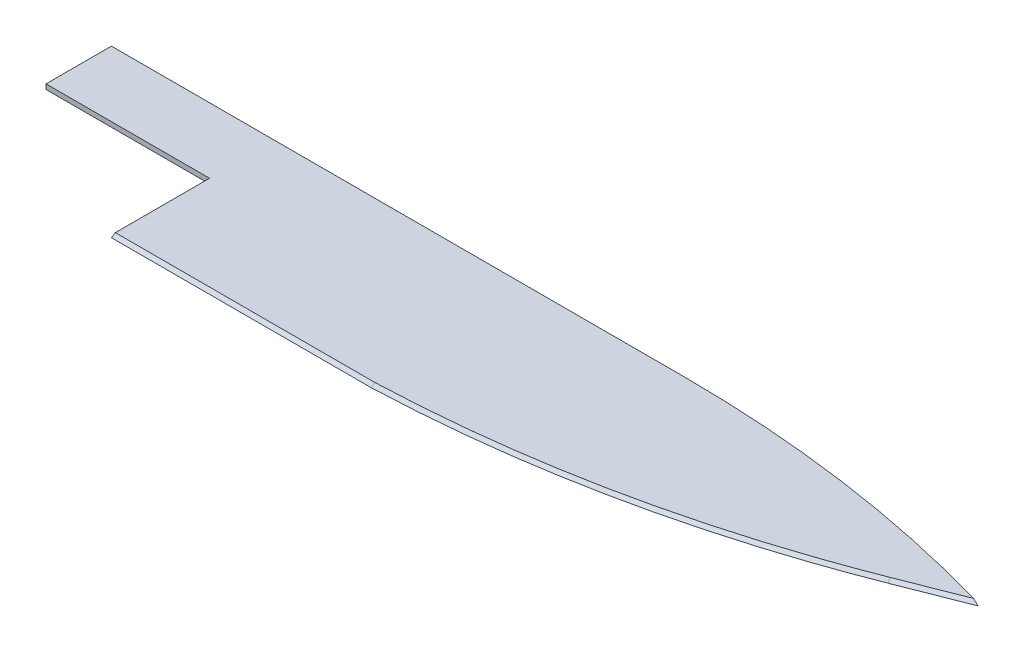
ISO-10303-21;
HEADER;
FILE_DESCRIPTION(('STEP AP214'),'2;1');
FILE_NAME('part.step','',(''),(''),'','','');
FILE_SCHEMA(('AUTOMOTIVE_DESIGN { 1 0 10303 214 1 1 1 1 }'));
ENDSEC;
DATA;
#1=APPLICATION_CONTEXT('core data for automotive mechanical design processes');
#2=APPLICATION_PROTOCOL_DEFINITION('international standard','automotive_design',2000,#1);
#3=PRODUCT_CONTEXT('',#1,'mechanical');
#4=PRODUCT('Part','Part','',(#3));
#5=PRODUCT_RELATED_PRODUCT_CATEGORY('part','',(#4));
#6=PRODUCT_DEFINITION_FORMATION('','',#4);
#7=PRODUCT_DEFINITION_CONTEXT('part definition',#1,'design');
#8=PRODUCT_DEFINITION('design','',#6,#7);
#9=PRODUCT_DEFINITION_SHAPE('','',#8);
#10=(LENGTH_UNIT() NAMED_UNIT(*) SI_UNIT(.MILLI.,.METRE.));
#11=(NAMED_UNIT(*) PLANE_ANGLE_UNIT() SI_UNIT($,.RADIAN.));
#12=(NAMED_UNIT(*) SI_UNIT($,.STERADIAN.) SOLID_ANGLE_UNIT());
#13=UNCERTAINTY_MEASURE_WITH_UNIT(LENGTH_MEASURE(1.E-05),#10,'distance_accuracy_value','');
#14=(GEOMETRIC_REPRESENTATION_CONTEXT(3) GLOBAL_UNCERTAINTY_ASSIGNED_CONTEXT((#13)) GLOBAL_UNIT_ASSIGNED_CONTEXT((#10,
#11,#12)) REPRESENTATION_CONTEXT('',''));
#15=CARTESIAN_POINT('',(0.,0.,0.));
#16=DIRECTION('',(0.,0.,1.));
#17=DIRECTION('',(1.,0.,0.));
#18=AXIS2_PLACEMENT_3D('',#15,#16,#17);
#19=CARTESIAN_POINT('',(64.3693837258981,0.,-349.715507265669));
#20=DIRECTION('',(0.,-1.,0.));
#21=DIRECTION('',(0.,0.,-1.));
#22=AXIS2_PLACEMENT_3D('',#19,#20,#21);
#23=PLANE('',#22);
#24=CARTESIAN_POINT('',(79.4302927640487,0.,48.8));
#25=CARTESIAN_POINT('',(91.8798427280316,0.,48.3302075818026));
#26=CARTESIAN_POINT('',(116.791222145986,0.,46.211286330398));
#27=CARTESIAN_POINT('',(160.715080879487,0.,38.2912391443894));
#28=CARTESIAN_POINT('',(191.538009217592,0.,28.7733382688752));
#29=CARTESIAN_POINT('',(209.790034488855,0.,21.6256759226194));
#30=B_SPLINE_CURVE_WITH_KNOTS('',3,(#24,#25,#26,#27,#28,#29),.UNSPECIFIED.,.F.,.F.,(4,1,1,4),
(0.,0.279630349358407,0.560257562786035,1.),.UNSPECIFIED.);
#31=CARTESIAN_POINT('',(79.4302927640487,0.,48.8));
#32=VERTEX_POINT('',#31);
#33=CARTESIAN_POINT('',(209.790034488855,0.,21.6256759226194));
#34=VERTEX_POINT('',#33);
#35=EDGE_CURVE('E140',#32,#34,#30,.T.);
#36=ORIENTED_EDGE('',*,*,#35,.F.);
#37=DIRECTION('',(-1.,0.,0.));
#38=VECTOR('',#37,1.);
#39=CARTESIAN_POINT('',(81.8148681108037,0.,48.8));
#40=LINE('',#39,#38);
#41=CARTESIAN_POINT('',(0.,0.,48.8));
#42=VERTEX_POINT('',#41);
#43=EDGE_CURVE('E166',#32,#42,#40,.T.);
#44=ORIENTED_EDGE('',*,*,#43,.T.);
#45=DIRECTION('',(0.,0.,1.));
#46=VECTOR('',#45,1.);
#47=CARTESIAN_POINT('',(0.,0.,50.));
#48=LINE('',#47,#46);
#49=CARTESIAN_POINT('',(0.,0.,20.));
#50=VERTEX_POINT('',#49);
#51=EDGE_CURVE('E201',#50,#42,#48,.T.);
#52=ORIENTED_EDGE('',*,*,#51,.F.);
#53=DIRECTION('',(1.,0.,0.));
#54=VECTOR('',#53,1.);
#55=CARTESIAN_POINT('',(-50.,0.,20.));
#56=LINE('',#55,#54);
#57=CARTESIAN_POINT('',(-50.,0.,20.));
#58=VERTEX_POINT('',#57);
#59=EDGE_CURVE('E220',#58,#50,#56,.T.);
#60=ORIENTED_EDGE('',*,*,#59,.F.);
#61=DIRECTION('',(0.,0.,1.));
#62=VECTOR('',#61,1.);
#63=CARTESIAN_POINT('',(-50.,0.,0.));
#64=LINE('',#63,#62);
#65=CARTESIAN_POINT('',(-50.,0.,0.));
#66=VERTEX_POINT('',#65);
#67=EDGE_CURVE('E187',#66,#58,#64,.T.);
#68=ORIENTED_EDGE('',*,*,#67,.F.);
#69=DIRECTION('',(-1.,0.,0.));
#70=VECTOR('',#69,1.);
#71=CARTESIAN_POINT('',(0.,0.,0.));
#72=LINE('',#71,#70);
#73=CARTESIAN_POINT('',(124.795351072606,0.,0.));
#74=VERTEX_POINT('',#73);
#75=EDGE_CURVE('E190',#74,#66,#72,.T.);
#76=ORIENTED_EDGE('',*,*,#75,.F.);
#77=CARTESIAN_POINT('',(124.795351072606,0.,376.433938531205));
#78=DIRECTION('',(0.,1.,0.));
#79=DIRECTION('',(0.,0.,-1.));
#80=AXIS2_PLACEMENT_3D('',#77,#78,#79);
#81=CIRCLE('',#80,376.433938531205);
#82=CARTESIAN_POINT('',(228.104370232939,0.,14.4536122174051));
#83=VERTEX_POINT('',#82);
#84=EDGE_CURVE('E86',#83,#74,#81,.T.);
#85=ORIENTED_EDGE('',*,*,#84,.F.);
#86=DIRECTION('',(0.931146397162208,0.,-0.364645563598186));
#87=VECTOR('',#86,1.);
#88=CARTESIAN_POINT('',(209.790034488855,0.,21.6256759226194));
#89=LINE('',#88,#87);
#90=EDGE_CURVE('E131',#34,#83,#89,.T.);
#91=ORIENTED_EDGE('',*,*,#90,.F.);
#92=EDGE_LOOP('',(#36,#44,#52,#60,#68,#76,#85,#91));
#93=FACE_BOUND('',#92,.T.);
#94=ADVANCED_FACE('F37',(#93),#23,.T.);
#95=CARTESIAN_POINT('',(-50.,1.5,0.));
#96=DIRECTION('',(1.,0.,0.));
#97=DIRECTION('',(0.,0.,-1.));
#98=AXIS2_PLACEMENT_3D('',#95,#96,#97);
#99=PLANE('',#98);
#100=ORIENTED_EDGE('',*,*,#67,.T.);
#101=DIRECTION('',(0.,-1.,0.));
#102=VECTOR('',#101,1.);
#103=CARTESIAN_POINT('',(-50.,1.5,20.));
#104=LINE('',#103,#102);
#105=CARTESIAN_POINT('',(-50.,1.5,20.));
#106=VERTEX_POINT('',#105);
#107=EDGE_CURVE('E46',#106,#58,#104,.T.);
#108=ORIENTED_EDGE('',*,*,#107,.F.);
#109=DIRECTION('',(0.,0.,1.));
#110=VECTOR('',#109,1.);
#111=CARTESIAN_POINT('',(-50.,1.5,0.));
#112=LINE('',#111,#110);
#113=CARTESIAN_POINT('',(-50.,1.5,0.));
#114=VERTEX_POINT('',#113);
#115=EDGE_CURVE('E93',#114,#106,#112,.T.);
#116=ORIENTED_EDGE('',*,*,#115,.F.);
#117=DIRECTION('',(0.,-1.,0.));
#118=VECTOR('',#117,1.);
#119=CARTESIAN_POINT('',(-50.,1.5,0.));
#120=LINE('',#119,#118);
#121=EDGE_CURVE('E12',#114,#66,#120,.T.);
#122=ORIENTED_EDGE('',*,*,#121,.T.);
#123=EDGE_LOOP('',(#100,#108,#116,#122));
#124=FACE_BOUND('',#123,.T.);
#125=ADVANCED_FACE('F39',(#124),#99,.F.);
#126=CARTESIAN_POINT('',(-50.,1.5,20.));
#127=DIRECTION('',(0.,0.,-1.));
#128=DIRECTION('',(-1.,0.,0.));
#129=AXIS2_PLACEMENT_3D('',#126,#127,#128);
#130=PLANE('',#129);
#131=ORIENTED_EDGE('',*,*,#59,.T.);
#132=DIRECTION('',(0.,-1.,0.));
#133=VECTOR('',#132,1.);
#134=CARTESIAN_POINT('',(0.,1.5,20.));
#135=LINE('',#134,#133);
#136=CARTESIAN_POINT('',(0.,1.5,20.));
#137=VERTEX_POINT('',#136);
#138=EDGE_CURVE('E217',#137,#50,#135,.T.);
#139=ORIENTED_EDGE('',*,*,#138,.F.);
#140=DIRECTION('',(1.,0.,0.));
#141=VECTOR('',#140,1.);
#142=CARTESIAN_POINT('',(-50.,1.5,20.));
#143=LINE('',#142,#141);
#144=EDGE_CURVE('E192',#106,#137,#143,.T.);
#145=ORIENTED_EDGE('',*,*,#144,.F.);
#146=ORIENTED_EDGE('',*,*,#107,.T.);
#147=EDGE_LOOP('',(#131,#139,#145,#146));
#148=FACE_BOUND('',#147,.T.);
#149=ADVANCED_FACE('F232',(#148),#130,.F.);
#150=CARTESIAN_POINT('',(0.,1.5,50.));
#151=DIRECTION('',(1.,0.,0.));
#152=DIRECTION('',(0.,0.,-1.));
#153=AXIS2_PLACEMENT_3D('',#150,#151,#152);
#154=PLANE('',#153);
#155=DIRECTION('',(0.,0.52999894000318,0.847998304005088));
#156=VECTOR('',#155,1.);
#157=CARTESIAN_POINT('',(0.,0.,48.8));
#158=LINE('',#157,#156);
#159=CARTESIAN_POINT('',(0.,0.75,50.));
#160=VERTEX_POINT('',#159);
#161=EDGE_CURVE('E153',#42,#160,#158,.T.);
#162=ORIENTED_EDGE('',*,*,#161,.T.);
#163=DIRECTION('',(0.,0.52999894000318,-0.847998304005088));
#164=VECTOR('',#163,1.);
#165=CARTESIAN_POINT('',(0.,0.75,50.));
#166=LINE('',#165,#164);
#167=CARTESIAN_POINT('',(0.,1.5,48.8));
#168=VERTEX_POINT('',#167);
#169=EDGE_CURVE('E157',#160,#168,#166,.T.);
#170=ORIENTED_EDGE('',*,*,#169,.T.);
#171=DIRECTION('',(0.,0.,1.));
#172=VECTOR('',#171,1.);
#173=CARTESIAN_POINT('',(0.,1.5,50.));
#174=LINE('',#173,#172);
#175=EDGE_CURVE('E194',#137,#168,#174,.T.);
#176=ORIENTED_EDGE('',*,*,#175,.F.);
#177=ORIENTED_EDGE('',*,*,#138,.T.);
#178=ORIENTED_EDGE('',*,*,#51,.T.);
#179=EDGE_LOOP('',(#162,#170,#176,#177,#178));
#180=FACE_BOUND('',#179,.T.);
#181=ADVANCED_FACE('F213',(#180),#154,.F.);
#182=CARTESIAN_POINT('',(124.795351072606,1.5,376.433938531205));
#183=DIRECTION('',(0.,-1.,0.));
#184=DIRECTION('',(0.,0.,-1.));
#185=AXIS2_PLACEMENT_3D('',#182,#183,#184);
#186=CYLINDRICAL_SURFACE('',#185,376.433938531205);
#187=CARTESIAN_POINT('',(124.795351072606,-185.615938233869,376.433938531205));
#188=DIRECTION('',(-0.193261762183896,-0.847998304005096,-0.493506603483739));
#189=DIRECTION('',(0.309218819494244,-0.529998940003167,0.789610565574008));
#190=AXIS2_PLACEMENT_3D('',#187,#188,#189);
#191=ELLIPSE('',#190,443.908834196139,376.433938531205);
#192=CARTESIAN_POINT('',(228.104370232939,1.5,14.4536122174051));
#193=VERTEX_POINT('',#192);
#194=CARTESIAN_POINT('',(230.,0.750000000000069,15.));
#195=VERTEX_POINT('',#194);
#196=EDGE_CURVE('E185',#193,#195,#191,.T.);
#197=ORIENTED_EDGE('',*,*,#196,.T.);
#198=CARTESIAN_POINT('',(124.795351072606,187.115938233869,376.433938531205));
#199=DIRECTION('',(-0.193261762183896,0.847998304005096,-0.493506603483739));
#200=DIRECTION('',(-0.309218819494244,-0.529998940003167,-0.789610565574008));
#201=AXIS2_PLACEMENT_3D('',#198,#199,#200);
#202=ELLIPSE('',#201,443.908834196139,376.433938531205);
#203=EDGE_CURVE('E129',#195,#83,#202,.T.);
#204=ORIENTED_EDGE('',*,*,#203,.T.);
#205=ORIENTED_EDGE('',*,*,#84,.T.);
#206=DIRECTION('',(0.,-1.,0.));
#207=VECTOR('',#206,1.);
#208=CARTESIAN_POINT('',(124.795351072606,1.5,0.));
#209=LINE('',#208,#207);
#210=CARTESIAN_POINT('',(124.795351072606,1.5,0.));
#211=VERTEX_POINT('',#210);
#212=EDGE_CURVE('E228',#211,#74,#209,.T.);
#213=ORIENTED_EDGE('',*,*,#212,.F.);
#214=CARTESIAN_POINT('',(124.795351072606,1.5,376.433938531205));
#215=DIRECTION('',(0.,1.,0.));
#216=DIRECTION('',(0.,0.,-1.));
#217=AXIS2_PLACEMENT_3D('',#214,#215,#216);
#218=CIRCLE('',#217,376.433938531205);
#219=EDGE_CURVE('E63',#193,#211,#218,.T.);
#220=ORIENTED_EDGE('',*,*,#219,.F.);
#221=EDGE_LOOP('',(#197,#204,#205,#213,#220));
#222=FACE_BOUND('',#221,.T.);
#223=ADVANCED_FACE('F238',(#222),#186,.T.);
#224=CARTESIAN_POINT('',(0.,1.5,0.));
#225=DIRECTION('',(0.,0.,1.));
#226=DIRECTION('',(1.,0.,0.));
#227=AXIS2_PLACEMENT_3D('',#224,#225,#226);
#228=PLANE('',#227);
#229=ORIENTED_EDGE('',*,*,#75,.T.);
#230=ORIENTED_EDGE('',*,*,#121,.F.);
#231=DIRECTION('',(-1.,0.,0.));
#232=VECTOR('',#231,1.);
#233=CARTESIAN_POINT('',(0.,1.5,0.));
#234=LINE('',#233,#232);
#235=EDGE_CURVE('E188',#211,#114,#234,.T.);
#236=ORIENTED_EDGE('',*,*,#235,.F.);
#237=ORIENTED_EDGE('',*,*,#212,.T.);
#238=EDGE_LOOP('',(#229,#230,#236,#237));
#239=FACE_BOUND('',#238,.T.);
#240=ADVANCED_FACE('F237',(#239),#228,.F.);
#241=CARTESIAN_POINT('',(64.3693837258981,1.5,-349.715507265669));
#242=DIRECTION('',(0.,-1.,0.));
#243=DIRECTION('',(0.,0.,-1.));
#244=AXIS2_PLACEMENT_3D('',#241,#242,#243);
#245=PLANE('',#244);
#246=CARTESIAN_POINT('',(79.4302927640487,1.5,48.8));
#247=CARTESIAN_POINT('',(91.8798427280316,1.5,48.3302075818026));
#248=CARTESIAN_POINT('',(116.791222145986,1.5,46.211286330398));
#249=CARTESIAN_POINT('',(160.715080879487,1.5,38.2912391443894));
#250=CARTESIAN_POINT('',(191.538009217592,1.5,28.7733382688752));
#251=CARTESIAN_POINT('',(209.790034488855,1.5,21.6256759226194));
#252=B_SPLINE_CURVE_WITH_KNOTS('',3,(#246,#247,#248,#249,#250,#251),.UNSPECIFIED.,.F.,.F.,(4,1,
1,4),(0.,0.279630349358407,0.560257562786035,1.),.UNSPECIFIED.);
#253=CARTESIAN_POINT('',(79.4302927640487,1.5,48.8));
#254=VERTEX_POINT('',#253);
#255=CARTESIAN_POINT('',(209.790034488855,1.5,21.6256759226194));
#256=VERTEX_POINT('',#255);
#257=EDGE_CURVE('E154',#254,#256,#252,.T.);
#258=ORIENTED_EDGE('',*,*,#257,.T.);
#259=DIRECTION('',(0.931146397162208,0.,-0.364645563598186));
#260=VECTOR('',#259,1.);
#261=CARTESIAN_POINT('',(209.790034488855,1.5,21.6256759226194));
#262=LINE('',#261,#260);
#263=EDGE_CURVE('E152',#256,#193,#262,.T.);
#264=ORIENTED_EDGE('',*,*,#263,.T.);
#265=ORIENTED_EDGE('',*,*,#219,.T.);
#266=ORIENTED_EDGE('',*,*,#235,.T.);
#267=ORIENTED_EDGE('',*,*,#115,.T.);
#268=ORIENTED_EDGE('',*,*,#144,.T.);
#269=ORIENTED_EDGE('',*,*,#175,.T.);
#270=DIRECTION('',(-1.,0.,0.));
#271=VECTOR('',#270,1.);
#272=CARTESIAN_POINT('',(81.8148681108037,1.5,48.8));
#273=LINE('',#272,#271);
#274=EDGE_CURVE('E176',#254,#168,#273,.T.);
#275=ORIENTED_EDGE('',*,*,#274,.F.);
#276=EDGE_LOOP('',(#258,#264,#265,#266,#267,#268,#269,#275));
#277=FACE_BOUND('',#276,.T.);
#278=ADVANCED_FACE('F239',(#277),#245,.F.);
#279=CARTESIAN_POINT('',(210.008821827014,1.125,22.1843637609167));
#280=DIRECTION('',(-0.193261762183896,-0.847998304005096,-0.493506603483739));
#281=DIRECTION('',(0.,0.502989344801032,-0.864292611918341));
#282=AXIS2_PLACEMENT_3D('',#279,#280,#281);
#283=PLANE('',#282);
#284=ORIENTED_EDGE('',*,*,#263,.F.);
#285=DIRECTION('',(-0.309218819494297,0.529998940003167,-0.789610565573987));
#286=VECTOR('',#285,1.);
#287=CARTESIAN_POINT('',(210.008821827014,1.125,22.1843637609167));
#288=LINE('',#287,#286);
#289=CARTESIAN_POINT('',(210.227609165173,0.749999999999996,22.743051599214));
#290=VERTEX_POINT('',#289);
#291=EDGE_CURVE('E146',#290,#256,#288,.T.);
#292=ORIENTED_EDGE('',*,*,#291,.F.);
#293=DIRECTION('',(0.931146397162208,0.,-0.364645563598186));
#294=VECTOR('',#293,1.);
#295=CARTESIAN_POINT('',(210.227609165173,0.749999999999996,22.743051599214));
#296=LINE('',#295,#294);
#297=EDGE_CURVE('E54',#290,#195,#296,.T.);
#298=ORIENTED_EDGE('',*,*,#297,.T.);
#299=ORIENTED_EDGE('',*,*,#196,.F.);
#300=EDGE_LOOP('',(#284,#292,#298,#299));
#301=FACE_BOUND('',#300,.T.);
#302=ADVANCED_FACE('F151',(#301),#283,.F.);
#303=CARTESIAN_POINT('',(210.008821827014,0.375000000000005,22.1843637609167));
#304=DIRECTION('',(-0.193261762183896,0.847998304005096,-0.493506603483739));
#305=DIRECTION('',(0.,0.502989344801032,0.864292611918341));
#306=AXIS2_PLACEMENT_3D('',#303,#304,#305);
#307=PLANE('',#306);
#308=ORIENTED_EDGE('',*,*,#297,.F.);
#309=DIRECTION('',(0.309218819494295,0.529998940003167,0.789610565573989));
#310=VECTOR('',#309,1.);
#311=CARTESIAN_POINT('',(210.008821827014,0.375000000000005,22.1843637609167));
#312=LINE('',#311,#310);
#313=EDGE_CURVE('E127',#34,#290,#312,.T.);
#314=ORIENTED_EDGE('',*,*,#313,.F.);
#315=ORIENTED_EDGE('',*,*,#90,.T.);
#316=ORIENTED_EDGE('',*,*,#203,.F.);
#317=EDGE_LOOP('',(#308,#314,#315,#316));
#318=FACE_BOUND('',#317,.T.);
#319=ADVANCED_FACE('F126',(#318),#307,.F.);
#320=CARTESIAN_POINT('',(81.8148681108037,0.75,50.));
#321=DIRECTION('',(0.,0.847998304005088,0.52999894000318));
#322=DIRECTION('',(0.,-0.52999894000318,0.847998304005088));
#323=AXIS2_PLACEMENT_3D('',#320,#321,#322);
#324=PLANE('',#323);
#325=DIRECTION('',(-0.0159921653781796,0.529931162226246,-0.847889859561993));
#326=VECTOR('',#325,1.);
#327=CARTESIAN_POINT('',(79.4535301915689,0.72998313976072,50.0320269763828));
#328=LINE('',#327,#326);
#329=CARTESIAN_POINT('',(79.4529261264334,0.750000000000009,50.));
#330=VERTEX_POINT('',#329);
#331=EDGE_CURVE('E132',#330,#254,#328,.T.);
#332=ORIENTED_EDGE('',*,*,#331,.T.);
#333=ORIENTED_EDGE('',*,*,#274,.T.);
#334=ORIENTED_EDGE('',*,*,#169,.F.);
#335=DIRECTION('',(-1.,0.,0.));
#336=VECTOR('',#335,1.);
#337=CARTESIAN_POINT('',(81.8148681108037,0.75,50.));
#338=LINE('',#337,#336);
#339=EDGE_CURVE('E170',#330,#160,#338,.T.);
#340=ORIENTED_EDGE('',*,*,#339,.F.);
#341=EDGE_LOOP('',(#332,#333,#334,#340));
#342=FACE_BOUND('',#341,.T.);
#343=ADVANCED_FACE('F209',(#342),#324,.T.);
#344=CARTESIAN_POINT('',(81.8148681108037,0.,48.8));
#345=DIRECTION('',(0.,-0.847998304005088,0.52999894000318));
#346=DIRECTION('',(0.,-0.52999894000318,-0.847998304005088));
#347=AXIS2_PLACEMENT_3D('',#344,#345,#346);
#348=PLANE('',#347);
#349=DIRECTION('',(0.0159921653781796,0.529931162226246,0.847889859561993));
#350=VECTOR('',#349,1.);
#351=CARTESIAN_POINT('',(79.430902617652,0.0202086722543919,48.832333875607));
#352=LINE('',#351,#350);
#353=EDGE_CURVE('E163',#32,#330,#352,.T.);
#354=ORIENTED_EDGE('',*,*,#353,.T.);
#355=ORIENTED_EDGE('',*,*,#339,.T.);
#356=ORIENTED_EDGE('',*,*,#161,.F.);
#357=ORIENTED_EDGE('',*,*,#43,.F.);
#358=EDGE_LOOP('',(#354,#355,#356,#357));
#359=FACE_BOUND('',#358,.T.);
#360=ADVANCED_FACE('F207',(#359),#348,.T.);
#361=CARTESIAN_POINT('',(79.4529261264334,0.749999999999996,50.));
#362=CARTESIAN_POINT('',(91.9474766827352,0.749999999999996,49.5285094531838));
#363=CARTESIAN_POINT('',(116.955813108535,0.749999999999997,47.4024104810868));
#364=CARTESIAN_POINT('',(161.001996140992,0.749999999999997,39.4588308474977));
#365=CARTESIAN_POINT('',(191.920697917479,0.749999999999997,29.9122078027947));
#366=CARTESIAN_POINT('',(210.227609165173,0.749999999999996,22.743051599214));
#367=CARTESIAN_POINT('',(79.4453816723052,0.999999999999998,49.6));
#368=CARTESIAN_POINT('',(91.9164033987775,0.999999999999998,49.1293973299259));
#369=CARTESIAN_POINT('',(116.905573446434,0.999999999999997,47.0049478458063));
#370=CARTESIAN_POINT('',(160.901494297782,0.999999999999997,39.0708948483461));
#371=CARTESIAN_POINT('',(191.803537153926,0.999999999999998,29.5285110517451));
#372=CARTESIAN_POINT('',(210.081750939733,0.999999999999997,22.3705930403491));
#373=CARTESIAN_POINT('',(79.437837218177,1.25,49.2));
#374=CARTESIAN_POINT('',(91.8853301148198,1.25,48.730285206668));
#375=CARTESIAN_POINT('',(116.855333784332,1.25,46.6074852105258));
#376=CARTESIAN_POINT('',(160.800992454572,1.25,38.6829588491945));
#377=CARTESIAN_POINT('',(191.686376390373,1.25,29.1448143006955));
#378=CARTESIAN_POINT('',(209.935892714294,1.25,21.9981344814842));
#379=CARTESIAN_POINT('',(79.4302927640487,1.5,48.8));
#380=CARTESIAN_POINT('',(91.8798427280316,1.5,48.3302075818026));
#381=CARTESIAN_POINT('',(116.791222145986,1.5,46.211286330398));
#382=CARTESIAN_POINT('',(160.715080879487,1.5,38.2912391443894));
#383=CARTESIAN_POINT('',(191.538009217592,1.5,28.7733382688752));
#384=CARTESIAN_POINT('',(209.790034488855,1.5,21.6256759226194));
#385=B_SPLINE_SURFACE_WITH_KNOTS('',3,3,((#361,#362,#363,#364,#365,#366),(#367,#368,#369,#370,
#371,#372),(#373,#374,#375,#376,#377,#378),(#379,#380,#381,#382,#383,#384)),.UNSPECIFIED.,.F.,
.F.,.F.,(4,4),(4,1,1,4),(0.,0.177041146199261),(0.,0.279630349358407,0.560257562786035,1.),.UNSPECIFIED.);
#386=CARTESIAN_POINT('',(79.4529261264334,0.749999999999996,50.));
#387=CARTESIAN_POINT('',(91.9474766827352,0.749999999999996,49.5285094531838));
#388=CARTESIAN_POINT('',(116.955813108535,0.749999999999997,47.4024104810868));
#389=CARTESIAN_POINT('',(161.001996140992,0.749999999999997,39.4588308474977));
#390=CARTESIAN_POINT('',(191.920697917479,0.749999999999997,29.9122078027947));
#391=CARTESIAN_POINT('',(210.227609165173,0.749999999999996,22.743051599214));
#392=B_SPLINE_CURVE_WITH_KNOTS('',3,(#386,#387,#388,#389,#390,#391),.UNSPECIFIED.,.F.,.F.,(4,1,
1,4),(0.,0.279630349358407,0.560257562786035,1.),.UNSPECIFIED.);
#393=EDGE_CURVE('E138',#330,#290,#392,.T.);
#394=ORIENTED_EDGE('',*,*,#331,.F.);
#395=ORIENTED_EDGE('',*,*,#393,.T.);
#396=ORIENTED_EDGE('',*,*,#291,.T.);
#397=ORIENTED_EDGE('',*,*,#257,.F.);
#398=EDGE_LOOP('',(#394,#395,#396,#397));
#399=FACE_BOUND('',#398,.T.);
#400=ADVANCED_FACE('F145',(#399),#385,.F.);
#401=CARTESIAN_POINT('',(79.4302927640487,0.,48.8));
#402=CARTESIAN_POINT('',(91.8798427280316,0.,48.3302075818026));
#403=CARTESIAN_POINT('',(116.791222145986,0.,46.211286330398));
#404=CARTESIAN_POINT('',(160.715080879487,0.,38.2912391443894));
#405=CARTESIAN_POINT('',(191.538009217592,0.,28.7733382688752));
#406=CARTESIAN_POINT('',(209.790034488855,0.,21.6256759226194));
#407=CARTESIAN_POINT('',(79.437837218177,0.250000000000003,49.2));
#408=CARTESIAN_POINT('',(91.8853301148198,0.250000000000003,48.730285206668));
#409=CARTESIAN_POINT('',(116.855333784332,0.250000000000003,46.6074852105258));
#410=CARTESIAN_POINT('',(160.800992454572,0.250000000000003,38.6829588491944));
#411=CARTESIAN_POINT('',(191.686376390373,0.250000000000003,29.1448143006955));
#412=CARTESIAN_POINT('',(209.935892714294,0.250000000000003,21.9981344814842));
#413=CARTESIAN_POINT('',(79.4453816723052,0.500000000000006,49.6));
#414=CARTESIAN_POINT('',(91.9164033987775,0.500000000000006,49.1293973299259));
#415=CARTESIAN_POINT('',(116.905573446434,0.500000000000006,47.0049478458063));
#416=CARTESIAN_POINT('',(160.901494297782,0.500000000000006,39.0708948483461));
#417=CARTESIAN_POINT('',(191.803537153926,0.500000000000006,29.5285110517451));
#418=CARTESIAN_POINT('',(210.081750939734,0.500000000000006,22.3705930403491));
#419=CARTESIAN_POINT('',(79.4529261264334,0.750000000000009,50.));
#420=CARTESIAN_POINT('',(91.9474766827352,0.750000000000008,49.5285094531838));
#421=CARTESIAN_POINT('',(116.955813108535,0.750000000000009,47.4024104810868));
#422=CARTESIAN_POINT('',(161.001996140992,0.750000000000009,39.4588308474978));
#423=CARTESIAN_POINT('',(191.920697917479,0.750000000000009,29.9122078027947));
#424=CARTESIAN_POINT('',(210.227609165173,0.750000000000009,22.743051599214));
#425=B_SPLINE_SURFACE_WITH_KNOTS('',3,3,((#401,#402,#403,#404,#405,#406),(#407,#408,#409,#410,
#411,#412),(#413,#414,#415,#416,#417,#418),(#419,#420,#421,#422,#423,#424)),.UNSPECIFIED.,.F.,
.F.,.F.,(4,4),(4,1,1,4),(0.822958853800738,1.),(0.,0.279630349358407,0.560257562786035,1.),.UNSPECIFIED.);
#426=ORIENTED_EDGE('',*,*,#353,.F.);
#427=ORIENTED_EDGE('',*,*,#35,.T.);
#428=ORIENTED_EDGE('',*,*,#313,.T.);
#429=ORIENTED_EDGE('',*,*,#393,.F.);
#430=EDGE_LOOP('',(#426,#427,#428,#429));
#431=FACE_BOUND('',#430,.T.);
#432=ADVANCED_FACE('F137',(#431),#425,.F.);
#433=CLOSED_SHELL('',(#94,#125,#149,#181,#223,#240,#278,#302,#319,#343,#360,#400,#432));
#434=MANIFOLD_SOLID_BREP('B2',#433);
#435=ADVANCED_BREP_SHAPE_REPRESENTATION('',(#18,#434),#14);
#436=SHAPE_DEFINITION_REPRESENTATION(#9,#435);
ENDSEC;
END-ISO-10303-21;
